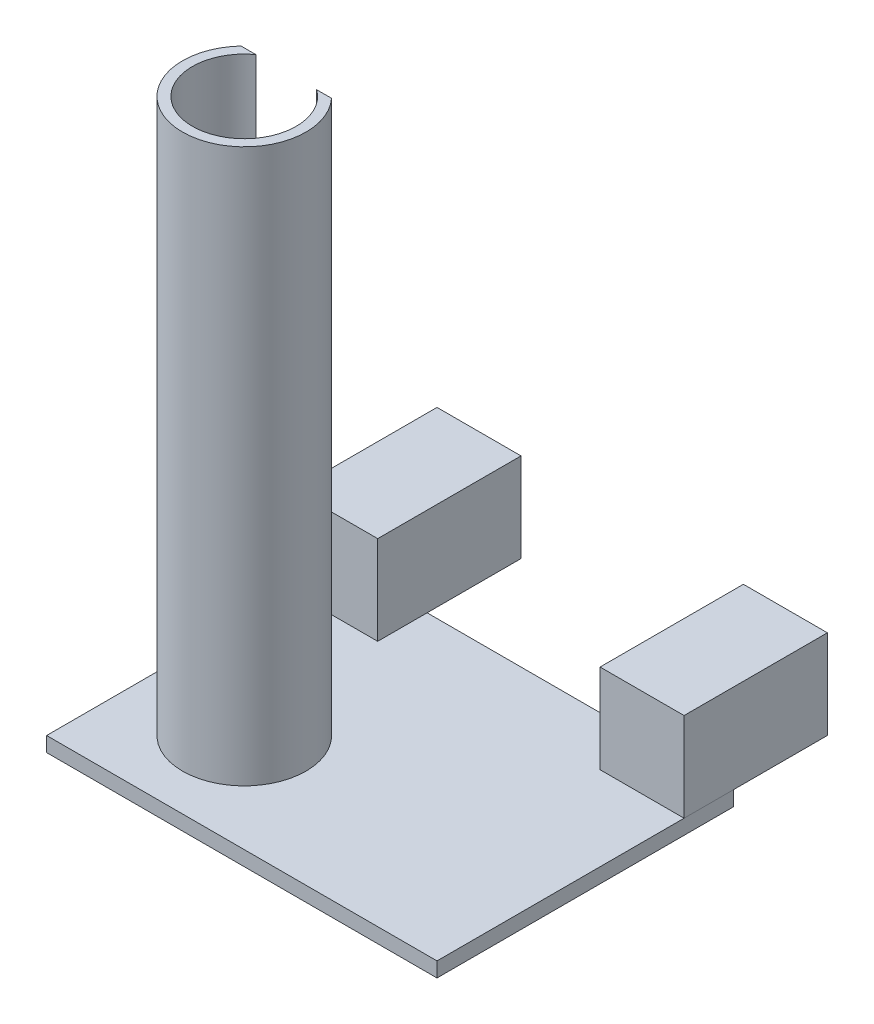
ISO-10303-21;
HEADER;
FILE_DESCRIPTION(('STEP AP214'),'2;1');
FILE_NAME('part.step','',(''),(''),'','','');
FILE_SCHEMA(('AUTOMOTIVE_DESIGN { 1 0 10303 214 1 1 1 1 }'));
ENDSEC;
DATA;
#1=APPLICATION_CONTEXT('core data for automotive mechanical design processes');
#2=APPLICATION_PROTOCOL_DEFINITION('international standard','automotive_design',2000,#1);
#3=PRODUCT_CONTEXT('',#1,'mechanical');
#4=PRODUCT('Part','Part','',(#3));
#5=PRODUCT_RELATED_PRODUCT_CATEGORY('part','',(#4));
#6=PRODUCT_DEFINITION_FORMATION('','',#4);
#7=PRODUCT_DEFINITION_CONTEXT('part definition',#1,'design');
#8=PRODUCT_DEFINITION('design','',#6,#7);
#9=PRODUCT_DEFINITION_SHAPE('','',#8);
#10=(LENGTH_UNIT() NAMED_UNIT(*) SI_UNIT(.MILLI.,.METRE.));
#11=(NAMED_UNIT(*) PLANE_ANGLE_UNIT() SI_UNIT($,.RADIAN.));
#12=(NAMED_UNIT(*) SI_UNIT($,.STERADIAN.) SOLID_ANGLE_UNIT());
#13=UNCERTAINTY_MEASURE_WITH_UNIT(LENGTH_MEASURE(1.E-05),#10,'distance_accuracy_value','');
#14=(GEOMETRIC_REPRESENTATION_CONTEXT(3) GLOBAL_UNCERTAINTY_ASSIGNED_CONTEXT((#13)) GLOBAL_UNIT_ASSIGNED_CONTEXT((#10,
#11,#12)) REPRESENTATION_CONTEXT('',''));
#15=CARTESIAN_POINT('',(0.,0.,0.));
#16=DIRECTION('',(0.,0.,1.));
#17=DIRECTION('',(1.,0.,0.));
#18=AXIS2_PLACEMENT_3D('',#15,#16,#17);
#19=CARTESIAN_POINT('',(39.5,21.,-20.));
#20=DIRECTION('',(-1.,0.,0.));
#21=DIRECTION('',(0.,0.,-1.));
#22=AXIS2_PLACEMENT_3D('',#19,#20,#21);
#23=PLANE('',#22);
#24=DIRECTION('',(0.,0.,1.));
#25=VECTOR('',#24,1.);
#26=CARTESIAN_POINT('',(39.5,3.,-20.));
#27=LINE('',#26,#25);
#28=CARTESIAN_POINT('',(39.5,3.,-49.));
#29=VERTEX_POINT('',#28);
#30=CARTESIAN_POINT('',(39.5,3.,-20.));
#31=VERTEX_POINT('',#30);
#32=EDGE_CURVE('E162',#29,#31,#27,.T.);
#33=ORIENTED_EDGE('',*,*,#32,.F.);
#34=DIRECTION('',(0.,-1.,0.));
#35=VECTOR('',#34,1.);
#36=CARTESIAN_POINT('',(39.5,21.,-49.));
#37=LINE('',#36,#35);
#38=CARTESIAN_POINT('',(39.5,21.,-49.));
#39=VERTEX_POINT('',#38);
#40=EDGE_CURVE('E174',#39,#29,#37,.T.);
#41=ORIENTED_EDGE('',*,*,#40,.F.);
#42=DIRECTION('',(0.,0.,1.));
#43=VECTOR('',#42,1.);
#44=CARTESIAN_POINT('',(39.5,21.,-20.));
#45=LINE('',#44,#43);
#46=CARTESIAN_POINT('',(39.5,21.,-20.));
#47=VERTEX_POINT('',#46);
#48=EDGE_CURVE('E166',#39,#47,#45,.T.);
#49=ORIENTED_EDGE('',*,*,#48,.T.);
#50=DIRECTION('',(0.,-1.,0.));
#51=VECTOR('',#50,1.);
#52=CARTESIAN_POINT('',(39.5,21.,-20.));
#53=LINE('',#52,#51);
#54=EDGE_CURVE('E12',#47,#31,#53,.T.);
#55=ORIENTED_EDGE('',*,*,#54,.T.);
#56=EDGE_LOOP('',(#33,#41,#49,#55));
#57=FACE_BOUND('',#56,.T.);
#58=ADVANCED_FACE('F55',(#57),#23,.F.);
#59=CARTESIAN_POINT('',(39.5,21.,-20.));
#60=DIRECTION('',(0.,0.,-1.));
#61=DIRECTION('',(1.,0.,0.));
#62=AXIS2_PLACEMENT_3D('',#59,#60,#61);
#63=PLANE('',#62);
#64=DIRECTION('',(-1.,0.,0.));
#65=VECTOR('',#64,1.);
#66=CARTESIAN_POINT('',(39.5,3.,-20.));
#67=LINE('',#66,#65);
#68=CARTESIAN_POINT('',(22.5,3.,-20.));
#69=VERTEX_POINT('',#68);
#70=EDGE_CURVE('E176',#31,#69,#67,.T.);
#71=ORIENTED_EDGE('',*,*,#70,.F.);
#72=ORIENTED_EDGE('',*,*,#54,.F.);
#73=DIRECTION('',(-1.,0.,0.));
#74=VECTOR('',#73,1.);
#75=CARTESIAN_POINT('',(39.5,21.,-20.));
#76=LINE('',#75,#74);
#77=CARTESIAN_POINT('',(22.5,21.,-20.));
#78=VERTEX_POINT('',#77);
#79=EDGE_CURVE('E105',#47,#78,#76,.T.);
#80=ORIENTED_EDGE('',*,*,#79,.T.);
#81=DIRECTION('',(0.,-1.,0.));
#82=VECTOR('',#81,1.);
#83=CARTESIAN_POINT('',(22.5,21.,-20.));
#84=LINE('',#83,#82);
#85=EDGE_CURVE('E62',#78,#69,#84,.T.);
#86=ORIENTED_EDGE('',*,*,#85,.T.);
#87=EDGE_LOOP('',(#71,#72,#80,#86));
#88=FACE_BOUND('',#87,.T.);
#89=ADVANCED_FACE('F188',(#88),#63,.F.);
#90=CARTESIAN_POINT('',(22.5,21.,-20.));
#91=DIRECTION('',(1.,0.,0.));
#92=DIRECTION('',(0.,0.,1.));
#93=AXIS2_PLACEMENT_3D('',#90,#91,#92);
#94=PLANE('',#93);
#95=DIRECTION('',(0.,0.,-1.));
#96=VECTOR('',#95,1.);
#97=CARTESIAN_POINT('',(22.5,3.,-20.));
#98=LINE('',#97,#96);
#99=CARTESIAN_POINT('',(22.5,3.,-49.));
#100=VERTEX_POINT('',#99);
#101=EDGE_CURVE('E179',#69,#100,#98,.T.);
#102=ORIENTED_EDGE('',*,*,#101,.F.);
#103=ORIENTED_EDGE('',*,*,#85,.F.);
#104=DIRECTION('',(0.,0.,-1.));
#105=VECTOR('',#104,1.);
#106=CARTESIAN_POINT('',(22.5,21.,-20.));
#107=LINE('',#106,#105);
#108=CARTESIAN_POINT('',(22.5,21.,-49.));
#109=VERTEX_POINT('',#108);
#110=EDGE_CURVE('E170',#78,#109,#107,.T.);
#111=ORIENTED_EDGE('',*,*,#110,.T.);
#112=DIRECTION('',(0.,-1.,0.));
#113=VECTOR('',#112,1.);
#114=CARTESIAN_POINT('',(22.5,21.,-49.));
#115=LINE('',#114,#113);
#116=EDGE_CURVE('E183',#109,#100,#115,.T.);
#117=ORIENTED_EDGE('',*,*,#116,.T.);
#118=EDGE_LOOP('',(#102,#103,#111,#117));
#119=FACE_BOUND('',#118,.T.);
#120=ADVANCED_FACE('F196',(#119),#94,.F.);
#121=CARTESIAN_POINT('',(39.5,21.,-49.));
#122=DIRECTION('',(0.,0.,1.));
#123=DIRECTION('',(-1.,0.,0.));
#124=AXIS2_PLACEMENT_3D('',#121,#122,#123);
#125=PLANE('',#124);
#126=DIRECTION('',(1.,0.,0.));
#127=VECTOR('',#126,1.);
#128=CARTESIAN_POINT('',(39.5,3.,-49.));
#129=LINE('',#128,#127);
#130=EDGE_CURVE('E99',#100,#29,#129,.T.);
#131=ORIENTED_EDGE('',*,*,#130,.F.);
#132=ORIENTED_EDGE('',*,*,#116,.F.);
#133=DIRECTION('',(1.,0.,0.));
#134=VECTOR('',#133,1.);
#135=CARTESIAN_POINT('',(39.5,21.,-49.));
#136=LINE('',#135,#134);
#137=EDGE_CURVE('E78',#109,#39,#136,.T.);
#138=ORIENTED_EDGE('',*,*,#137,.T.);
#139=ORIENTED_EDGE('',*,*,#40,.T.);
#140=EDGE_LOOP('',(#131,#132,#138,#139));
#141=FACE_BOUND('',#140,.T.);
#142=ADVANCED_FACE('F195',(#141),#125,.F.);
#143=CARTESIAN_POINT('',(0.,21.,0.));
#144=DIRECTION('',(0.,-1.,0.));
#145=DIRECTION('',(0.,0.,-1.));
#146=AXIS2_PLACEMENT_3D('',#143,#144,#145);
#147=PLANE('',#146);
#148=ORIENTED_EDGE('',*,*,#48,.F.);
#149=ORIENTED_EDGE('',*,*,#137,.F.);
#150=ORIENTED_EDGE('',*,*,#110,.F.);
#151=ORIENTED_EDGE('',*,*,#79,.F.);
#152=EDGE_LOOP('',(#148,#149,#150,#151));
#153=FACE_BOUND('',#152,.T.);
#154=ADVANCED_FACE('F194',(#153),#147,.F.);
#155=CARTESIAN_POINT('',(0.,3.,0.));
#156=DIRECTION('',(0.,-1.,0.));
#157=DIRECTION('',(0.,0.,-1.));
#158=AXIS2_PLACEMENT_3D('',#155,#156,#157);
#159=PLANE('',#158);
#160=DIRECTION('',(0.,0.,-1.));
#161=VECTOR('',#160,1.);
#162=CARTESIAN_POINT('',(38.,3.,-32.5));
#163=LINE('',#162,#161);
#164=CARTESIAN_POINT('',(38.,3.,-32.5));
#165=VERTEX_POINT('',#164);
#166=CARTESIAN_POINT('',(38.,3.,-46.5));
#167=VERTEX_POINT('',#166);
#168=EDGE_CURVE('E156',#165,#167,#163,.T.);
#169=ORIENTED_EDGE('',*,*,#168,.T.);
#170=DIRECTION('',(-1.,0.,0.));
#171=VECTOR('',#170,1.);
#172=CARTESIAN_POINT('',(38.,3.,-46.5));
#173=LINE('',#172,#171);
#174=CARTESIAN_POINT('',(24.,3.,-46.5));
#175=VERTEX_POINT('',#174);
#176=EDGE_CURVE('E141',#167,#175,#173,.T.);
#177=ORIENTED_EDGE('',*,*,#176,.T.);
#178=DIRECTION('',(0.,0.,1.));
#179=VECTOR('',#178,1.);
#180=CARTESIAN_POINT('',(24.,3.,-32.5));
#181=LINE('',#180,#179);
#182=CARTESIAN_POINT('',(24.,3.,-32.5));
#183=VERTEX_POINT('',#182);
#184=EDGE_CURVE('E151',#175,#183,#181,.T.);
#185=ORIENTED_EDGE('',*,*,#184,.T.);
#186=DIRECTION('',(1.,0.,0.));
#187=VECTOR('',#186,1.);
#188=CARTESIAN_POINT('',(38.,3.,-32.5));
#189=LINE('',#188,#187);
#190=EDGE_CURVE('E148',#183,#165,#189,.T.);
#191=ORIENTED_EDGE('',*,*,#190,.T.);
#192=EDGE_LOOP('',(#169,#177,#185,#191));
#193=FACE_BOUND('',#192,.T.);
#194=ORIENTED_EDGE('',*,*,#32,.T.);
#195=ORIENTED_EDGE('',*,*,#70,.T.);
#196=ORIENTED_EDGE('',*,*,#101,.T.);
#197=ORIENTED_EDGE('',*,*,#130,.T.);
#198=EDGE_LOOP('',(#194,#195,#196,#197));
#199=FACE_BOUND('',#198,.T.);
#200=ADVANCED_FACE('F190',(#193,#199),#159,.T.);
#201=CARTESIAN_POINT('',(38.,19.,-32.5));
#202=DIRECTION('',(1.,0.,0.));
#203=DIRECTION('',(0.,0.,1.));
#204=AXIS2_PLACEMENT_3D('',#201,#202,#203);
#205=PLANE('',#204);
#206=ORIENTED_EDGE('',*,*,#168,.F.);
#207=DIRECTION('',(0.,-1.,0.));
#208=VECTOR('',#207,1.);
#209=CARTESIAN_POINT('',(38.,19.,-32.5));
#210=LINE('',#209,#208);
#211=CARTESIAN_POINT('',(38.,19.,-32.5));
#212=VERTEX_POINT('',#211);
#213=EDGE_CURVE('E147',#212,#165,#210,.T.);
#214=ORIENTED_EDGE('',*,*,#213,.F.);
#215=DIRECTION('',(0.,0.,-1.));
#216=VECTOR('',#215,1.);
#217=CARTESIAN_POINT('',(38.,19.,-32.5));
#218=LINE('',#217,#216);
#219=CARTESIAN_POINT('',(38.,19.,-46.5));
#220=VERTEX_POINT('',#219);
#221=EDGE_CURVE('E133',#212,#220,#218,.T.);
#222=ORIENTED_EDGE('',*,*,#221,.T.);
#223=DIRECTION('',(0.,-1.,0.));
#224=VECTOR('',#223,1.);
#225=CARTESIAN_POINT('',(38.,19.,-46.5));
#226=LINE('',#225,#224);
#227=EDGE_CURVE('E69',#220,#167,#226,.T.);
#228=ORIENTED_EDGE('',*,*,#227,.T.);
#229=EDGE_LOOP('',(#206,#214,#222,#228));
#230=FACE_BOUND('',#229,.T.);
#231=ADVANCED_FACE('F146',(#230),#205,.F.);
#232=CARTESIAN_POINT('',(38.,19.,-32.5));
#233=DIRECTION('',(0.,0.,1.));
#234=DIRECTION('',(-1.,0.,0.));
#235=AXIS2_PLACEMENT_3D('',#232,#233,#234);
#236=PLANE('',#235);
#237=ORIENTED_EDGE('',*,*,#190,.F.);
#238=DIRECTION('',(0.,-1.,0.));
#239=VECTOR('',#238,1.);
#240=CARTESIAN_POINT('',(24.,19.,-32.5));
#241=LINE('',#240,#239);
#242=CARTESIAN_POINT('',(24.,19.,-32.5));
#243=VERTEX_POINT('',#242);
#244=EDGE_CURVE('E163',#243,#183,#241,.T.);
#245=ORIENTED_EDGE('',*,*,#244,.F.);
#246=DIRECTION('',(1.,0.,0.));
#247=VECTOR('',#246,1.);
#248=CARTESIAN_POINT('',(38.,19.,-32.5));
#249=LINE('',#248,#247);
#250=EDGE_CURVE('E144',#243,#212,#249,.T.);
#251=ORIENTED_EDGE('',*,*,#250,.T.);
#252=ORIENTED_EDGE('',*,*,#213,.T.);
#253=EDGE_LOOP('',(#237,#245,#251,#252));
#254=FACE_BOUND('',#253,.T.);
#255=ADVANCED_FACE('F247',(#254),#236,.F.);
#256=CARTESIAN_POINT('',(24.,19.,-32.5));
#257=DIRECTION('',(-1.,0.,0.));
#258=DIRECTION('',(0.,0.,-1.));
#259=AXIS2_PLACEMENT_3D('',#256,#257,#258);
#260=PLANE('',#259);
#261=ORIENTED_EDGE('',*,*,#184,.F.);
#262=DIRECTION('',(0.,-1.,0.));
#263=VECTOR('',#262,1.);
#264=CARTESIAN_POINT('',(24.,19.,-46.5));
#265=LINE('',#264,#263);
#266=CARTESIAN_POINT('',(24.,19.,-46.5));
#267=VERTEX_POINT('',#266);
#268=EDGE_CURVE('E143',#267,#175,#265,.T.);
#269=ORIENTED_EDGE('',*,*,#268,.F.);
#270=DIRECTION('',(0.,0.,1.));
#271=VECTOR('',#270,1.);
#272=CARTESIAN_POINT('',(24.,19.,-32.5));
#273=LINE('',#272,#271);
#274=EDGE_CURVE('E135',#267,#243,#273,.T.);
#275=ORIENTED_EDGE('',*,*,#274,.T.);
#276=ORIENTED_EDGE('',*,*,#244,.T.);
#277=EDGE_LOOP('',(#261,#269,#275,#276));
#278=FACE_BOUND('',#277,.T.);
#279=ADVANCED_FACE('F256',(#278),#260,.F.);
#280=CARTESIAN_POINT('',(38.,19.,-46.5));
#281=DIRECTION('',(0.,0.,-1.));
#282=DIRECTION('',(1.,0.,0.));
#283=AXIS2_PLACEMENT_3D('',#280,#281,#282);
#284=PLANE('',#283);
#285=ORIENTED_EDGE('',*,*,#176,.F.);
#286=ORIENTED_EDGE('',*,*,#227,.F.);
#287=DIRECTION('',(-1.,0.,0.));
#288=VECTOR('',#287,1.);
#289=CARTESIAN_POINT('',(38.,19.,-46.5));
#290=LINE('',#289,#288);
#291=EDGE_CURVE('E130',#220,#267,#290,.T.);
#292=ORIENTED_EDGE('',*,*,#291,.T.);
#293=ORIENTED_EDGE('',*,*,#268,.T.);
#294=EDGE_LOOP('',(#285,#286,#292,#293));
#295=FACE_BOUND('',#294,.T.);
#296=ADVANCED_FACE('F139',(#295),#284,.F.);
#297=CARTESIAN_POINT('',(0.,19.,0.));
#298=DIRECTION('',(0.,-1.,0.));
#299=DIRECTION('',(0.,0.,-1.));
#300=AXIS2_PLACEMENT_3D('',#297,#298,#299);
#301=PLANE('',#300);
#302=ORIENTED_EDGE('',*,*,#221,.F.);
#303=ORIENTED_EDGE('',*,*,#250,.F.);
#304=ORIENTED_EDGE('',*,*,#274,.F.);
#305=ORIENTED_EDGE('',*,*,#291,.F.);
#306=EDGE_LOOP('',(#302,#303,#304,#305));
#307=FACE_BOUND('',#306,.T.);
#308=ADVANCED_FACE('F131',(#307),#301,.T.);
#309=CLOSED_SHELL('',(#58,#89,#120,#142,#154,#200,#231,#255,#279,#296,#308));
#310=MANIFOLD_SOLID_BREP('B2',#309);
#311=CARTESIAN_POINT('',(-39.5,21.,-20.));
#312=DIRECTION('',(1.,0.,0.));
#313=DIRECTION('',(0.,0.,-1.));
#314=AXIS2_PLACEMENT_3D('',#311,#312,#313);
#315=PLANE('',#314);
#316=DIRECTION('',(0.,0.,1.));
#317=VECTOR('',#316,1.);
#318=CARTESIAN_POINT('',(-39.5,3.,-20.));
#319=LINE('',#318,#317);
#320=CARTESIAN_POINT('',(-39.5,3.,-49.));
#321=VERTEX_POINT('',#320);
#322=CARTESIAN_POINT('',(-39.5,3.,-20.));
#323=VERTEX_POINT('',#322);
#324=EDGE_CURVE('E454',#321,#323,#319,.T.);
#325=ORIENTED_EDGE('',*,*,#324,.T.);
#326=DIRECTION('',(0.,-1.,0.));
#327=VECTOR('',#326,1.);
#328=CARTESIAN_POINT('',(-39.5,21.,-20.));
#329=LINE('',#328,#327);
#330=CARTESIAN_POINT('',(-39.5,21.,-20.));
#331=VERTEX_POINT('',#330);
#332=EDGE_CURVE('E53',#331,#323,#329,.T.);
#333=ORIENTED_EDGE('',*,*,#332,.F.);
#334=DIRECTION('',(0.,0.,1.));
#335=VECTOR('',#334,1.);
#336=CARTESIAN_POINT('',(-39.5,21.,-20.));
#337=LINE('',#336,#335);
#338=CARTESIAN_POINT('',(-39.5,21.,-49.));
#339=VERTEX_POINT('',#338);
#340=EDGE_CURVE('E458',#339,#331,#337,.T.);
#341=ORIENTED_EDGE('',*,*,#340,.F.);
#342=DIRECTION('',(0.,-1.,0.));
#343=VECTOR('',#342,1.);
#344=CARTESIAN_POINT('',(-39.5,21.,-49.));
#345=LINE('',#344,#343);
#346=EDGE_CURVE('E464',#339,#321,#345,.T.);
#347=ORIENTED_EDGE('',*,*,#346,.T.);
#348=EDGE_LOOP('',(#325,#333,#341,#347));
#349=FACE_BOUND('',#348,.T.);
#350=ADVANCED_FACE('F346',(#349),#315,.F.);
#351=CARTESIAN_POINT('',(-39.5,21.,-20.));
#352=DIRECTION('',(0.,0.,-1.));
#353=DIRECTION('',(-1.,0.,0.));
#354=AXIS2_PLACEMENT_3D('',#351,#352,#353);
#355=PLANE('',#354);
#356=DIRECTION('',(1.,0.,0.));
#357=VECTOR('',#356,1.);
#358=CARTESIAN_POINT('',(-39.5,3.,-20.));
#359=LINE('',#358,#357);
#360=CARTESIAN_POINT('',(-22.5,3.,-20.));
#361=VERTEX_POINT('',#360);
#362=EDGE_CURVE('E467',#323,#361,#359,.T.);
#363=ORIENTED_EDGE('',*,*,#362,.T.);
#364=DIRECTION('',(0.,-1.,0.));
#365=VECTOR('',#364,1.);
#366=CARTESIAN_POINT('',(-22.5,21.,-20.));
#367=LINE('',#366,#365);
#368=CARTESIAN_POINT('',(-22.5,21.,-20.));
#369=VERTEX_POINT('',#368);
#370=EDGE_CURVE('E353',#369,#361,#367,.T.);
#371=ORIENTED_EDGE('',*,*,#370,.F.);
#372=DIRECTION('',(1.,0.,0.));
#373=VECTOR('',#372,1.);
#374=CARTESIAN_POINT('',(-39.5,21.,-20.));
#375=LINE('',#374,#373);
#376=EDGE_CURVE('E397',#331,#369,#375,.T.);
#377=ORIENTED_EDGE('',*,*,#376,.F.);
#378=ORIENTED_EDGE('',*,*,#332,.T.);
#379=EDGE_LOOP('',(#363,#371,#377,#378));
#380=FACE_BOUND('',#379,.T.);
#381=ADVANCED_FACE('F495',(#380),#355,.F.);
#382=CARTESIAN_POINT('',(-22.5,21.,-20.));
#383=DIRECTION('',(-1.,0.,0.));
#384=DIRECTION('',(0.,0.,1.));
#385=AXIS2_PLACEMENT_3D('',#382,#383,#384);
#386=PLANE('',#385);
#387=DIRECTION('',(0.,0.,-1.));
#388=VECTOR('',#387,1.);
#389=CARTESIAN_POINT('',(-22.5,3.,-20.));
#390=LINE('',#389,#388);
#391=CARTESIAN_POINT('',(-22.5,3.,-49.));
#392=VERTEX_POINT('',#391);
#393=EDGE_CURVE('E469',#361,#392,#390,.T.);
#394=ORIENTED_EDGE('',*,*,#393,.T.);
#395=DIRECTION('',(0.,-1.,0.));
#396=VECTOR('',#395,1.);
#397=CARTESIAN_POINT('',(-22.5,21.,-49.));
#398=LINE('',#397,#396);
#399=CARTESIAN_POINT('',(-22.5,21.,-49.));
#400=VERTEX_POINT('',#399);
#401=EDGE_CURVE('E473',#400,#392,#398,.T.);
#402=ORIENTED_EDGE('',*,*,#401,.F.);
#403=DIRECTION('',(0.,0.,-1.));
#404=VECTOR('',#403,1.);
#405=CARTESIAN_POINT('',(-22.5,21.,-20.));
#406=LINE('',#405,#404);
#407=EDGE_CURVE('E461',#369,#400,#406,.T.);
#408=ORIENTED_EDGE('',*,*,#407,.F.);
#409=ORIENTED_EDGE('',*,*,#370,.T.);
#410=EDGE_LOOP('',(#394,#402,#408,#409));
#411=FACE_BOUND('',#410,.T.);
#412=ADVANCED_FACE('F478',(#411),#386,.F.);
#413=CARTESIAN_POINT('',(-39.5,21.,-49.));
#414=DIRECTION('',(0.,0.,1.));
#415=DIRECTION('',(1.,0.,0.));
#416=AXIS2_PLACEMENT_3D('',#413,#414,#415);
#417=PLANE('',#416);
#418=DIRECTION('',(-1.,0.,0.));
#419=VECTOR('',#418,1.);
#420=CARTESIAN_POINT('',(-39.5,3.,-49.));
#421=LINE('',#420,#419);
#422=EDGE_CURVE('E390',#392,#321,#421,.T.);
#423=ORIENTED_EDGE('',*,*,#422,.T.);
#424=ORIENTED_EDGE('',*,*,#346,.F.);
#425=DIRECTION('',(-1.,0.,0.));
#426=VECTOR('',#425,1.);
#427=CARTESIAN_POINT('',(-39.5,21.,-49.));
#428=LINE('',#427,#426);
#429=EDGE_CURVE('E369',#400,#339,#428,.T.);
#430=ORIENTED_EDGE('',*,*,#429,.F.);
#431=ORIENTED_EDGE('',*,*,#401,.T.);
#432=EDGE_LOOP('',(#423,#424,#430,#431));
#433=FACE_BOUND('',#432,.T.);
#434=ADVANCED_FACE('F486',(#433),#417,.F.);
#435=CARTESIAN_POINT('',(0.,21.,0.));
#436=DIRECTION('',(0.,-1.,0.));
#437=DIRECTION('',(0.,0.,-1.));
#438=AXIS2_PLACEMENT_3D('',#435,#436,#437);
#439=PLANE('',#438);
#440=ORIENTED_EDGE('',*,*,#340,.T.);
#441=ORIENTED_EDGE('',*,*,#376,.T.);
#442=ORIENTED_EDGE('',*,*,#407,.T.);
#443=ORIENTED_EDGE('',*,*,#429,.T.);
#444=EDGE_LOOP('',(#440,#441,#442,#443));
#445=FACE_BOUND('',#444,.T.);
#446=ADVANCED_FACE('F488',(#445),#439,.F.);
#447=CARTESIAN_POINT('',(0.,3.,0.));
#448=DIRECTION('',(0.,-1.,0.));
#449=DIRECTION('',(0.,0.,-1.));
#450=AXIS2_PLACEMENT_3D('',#447,#448,#449);
#451=PLANE('',#450);
#452=DIRECTION('',(0.,0.,-1.));
#453=VECTOR('',#452,1.);
#454=CARTESIAN_POINT('',(-38.,3.,-32.5));
#455=LINE('',#454,#453);
#456=CARTESIAN_POINT('',(-38.,3.,-32.5));
#457=VERTEX_POINT('',#456);
#458=CARTESIAN_POINT('',(-38.,3.,-46.5));
#459=VERTEX_POINT('',#458);
#460=EDGE_CURVE('E360',#457,#459,#455,.T.);
#461=ORIENTED_EDGE('',*,*,#460,.F.);
#462=DIRECTION('',(-1.,0.,0.));
#463=VECTOR('',#462,1.);
#464=CARTESIAN_POINT('',(-38.,3.,-32.5));
#465=LINE('',#464,#463);
#466=CARTESIAN_POINT('',(-24.,3.,-32.5));
#467=VERTEX_POINT('',#466);
#468=EDGE_CURVE('E439',#467,#457,#465,.T.);
#469=ORIENTED_EDGE('',*,*,#468,.F.);
#470=DIRECTION('',(0.,0.,1.));
#471=VECTOR('',#470,1.);
#472=CARTESIAN_POINT('',(-24.,3.,-32.5));
#473=LINE('',#472,#471);
#474=CARTESIAN_POINT('',(-24.,3.,-46.5));
#475=VERTEX_POINT('',#474);
#476=EDGE_CURVE('E442',#475,#467,#473,.T.);
#477=ORIENTED_EDGE('',*,*,#476,.F.);
#478=DIRECTION('',(1.,0.,0.));
#479=VECTOR('',#478,1.);
#480=CARTESIAN_POINT('',(-38.,3.,-46.5));
#481=LINE('',#480,#479);
#482=EDGE_CURVE('E448',#459,#475,#481,.T.);
#483=ORIENTED_EDGE('',*,*,#482,.F.);
#484=EDGE_LOOP('',(#461,#469,#477,#483));
#485=FACE_BOUND('',#484,.T.);
#486=ORIENTED_EDGE('',*,*,#324,.F.);
#487=ORIENTED_EDGE('',*,*,#422,.F.);
#488=ORIENTED_EDGE('',*,*,#393,.F.);
#489=ORIENTED_EDGE('',*,*,#362,.F.);
#490=EDGE_LOOP('',(#486,#487,#488,#489));
#491=FACE_BOUND('',#490,.T.);
#492=ADVANCED_FACE('F482',(#485,#491),#451,.T.);
#493=CARTESIAN_POINT('',(-38.,19.,-32.5));
#494=DIRECTION('',(-1.,0.,0.));
#495=DIRECTION('',(0.,0.,1.));
#496=AXIS2_PLACEMENT_3D('',#493,#494,#495);
#497=PLANE('',#496);
#498=ORIENTED_EDGE('',*,*,#460,.T.);
#499=DIRECTION('',(0.,-1.,0.));
#500=VECTOR('',#499,1.);
#501=CARTESIAN_POINT('',(-38.,19.,-46.5));
#502=LINE('',#501,#500);
#503=CARTESIAN_POINT('',(-38.,19.,-46.5));
#504=VERTEX_POINT('',#503);
#505=EDGE_CURVE('E417',#504,#459,#502,.T.);
#506=ORIENTED_EDGE('',*,*,#505,.F.);
#507=DIRECTION('',(0.,0.,-1.));
#508=VECTOR('',#507,1.);
#509=CARTESIAN_POINT('',(-38.,19.,-32.5));
#510=LINE('',#509,#508);
#511=CARTESIAN_POINT('',(-38.,19.,-32.5));
#512=VERTEX_POINT('',#511);
#513=EDGE_CURVE('E421',#512,#504,#510,.T.);
#514=ORIENTED_EDGE('',*,*,#513,.F.);
#515=DIRECTION('',(0.,-1.,0.));
#516=VECTOR('',#515,1.);
#517=CARTESIAN_POINT('',(-38.,19.,-32.5));
#518=LINE('',#517,#516);
#519=EDGE_CURVE('E452',#512,#457,#518,.T.);
#520=ORIENTED_EDGE('',*,*,#519,.T.);
#521=EDGE_LOOP('',(#498,#506,#514,#520));
#522=FACE_BOUND('',#521,.T.);
#523=ADVANCED_FACE('F419',(#522),#497,.F.);
#524=CARTESIAN_POINT('',(-38.,19.,-32.5));
#525=DIRECTION('',(0.,0.,1.));
#526=DIRECTION('',(1.,0.,0.));
#527=AXIS2_PLACEMENT_3D('',#524,#525,#526);
#528=PLANE('',#527);
#529=ORIENTED_EDGE('',*,*,#468,.T.);
#530=ORIENTED_EDGE('',*,*,#519,.F.);
#531=DIRECTION('',(-1.,0.,0.));
#532=VECTOR('',#531,1.);
#533=CARTESIAN_POINT('',(-38.,19.,-32.5));
#534=LINE('',#533,#532);
#535=CARTESIAN_POINT('',(-24.,19.,-32.5));
#536=VERTEX_POINT('',#535);
#537=EDGE_CURVE('E427',#536,#512,#534,.T.);
#538=ORIENTED_EDGE('',*,*,#537,.F.);
#539=DIRECTION('',(0.,-1.,0.));
#540=VECTOR('',#539,1.);
#541=CARTESIAN_POINT('',(-24.,19.,-32.5));
#542=LINE('',#541,#540);
#543=EDGE_CURVE('E455',#536,#467,#542,.T.);
#544=ORIENTED_EDGE('',*,*,#543,.T.);
#545=EDGE_LOOP('',(#529,#530,#538,#544));
#546=FACE_BOUND('',#545,.T.);
#547=ADVANCED_FACE('F535',(#546),#528,.F.);
#548=CARTESIAN_POINT('',(-24.,19.,-32.5));
#549=DIRECTION('',(1.,0.,0.));
#550=DIRECTION('',(0.,0.,-1.));
#551=AXIS2_PLACEMENT_3D('',#548,#549,#550);
#552=PLANE('',#551);
#553=ORIENTED_EDGE('',*,*,#476,.T.);
#554=ORIENTED_EDGE('',*,*,#543,.F.);
#555=DIRECTION('',(0.,0.,1.));
#556=VECTOR('',#555,1.);
#557=CARTESIAN_POINT('',(-24.,19.,-32.5));
#558=LINE('',#557,#556);
#559=CARTESIAN_POINT('',(-24.,19.,-46.5));
#560=VERTEX_POINT('',#559);
#561=EDGE_CURVE('E435',#560,#536,#558,.T.);
#562=ORIENTED_EDGE('',*,*,#561,.F.);
#563=DIRECTION('',(0.,-1.,0.));
#564=VECTOR('',#563,1.);
#565=CARTESIAN_POINT('',(-24.,19.,-46.5));
#566=LINE('',#565,#564);
#567=EDGE_CURVE('E426',#560,#475,#566,.T.);
#568=ORIENTED_EDGE('',*,*,#567,.T.);
#569=EDGE_LOOP('',(#553,#554,#562,#568));
#570=FACE_BOUND('',#569,.T.);
#571=ADVANCED_FACE('F544',(#570),#552,.F.);
#572=CARTESIAN_POINT('',(-38.,19.,-46.5));
#573=DIRECTION('',(0.,0.,-1.));
#574=DIRECTION('',(-1.,0.,0.));
#575=AXIS2_PLACEMENT_3D('',#572,#573,#574);
#576=PLANE('',#575);
#577=ORIENTED_EDGE('',*,*,#482,.T.);
#578=ORIENTED_EDGE('',*,*,#567,.F.);
#579=DIRECTION('',(1.,0.,0.));
#580=VECTOR('',#579,1.);
#581=CARTESIAN_POINT('',(-38.,19.,-46.5));
#582=LINE('',#581,#580);
#583=EDGE_CURVE('E430',#504,#560,#582,.T.);
#584=ORIENTED_EDGE('',*,*,#583,.F.);
#585=ORIENTED_EDGE('',*,*,#505,.T.);
#586=EDGE_LOOP('',(#577,#578,#584,#585));
#587=FACE_BOUND('',#586,.T.);
#588=ADVANCED_FACE('F431',(#587),#576,.F.);
#589=CARTESIAN_POINT('',(0.,19.,0.));
#590=DIRECTION('',(0.,-1.,0.));
#591=DIRECTION('',(0.,0.,-1.));
#592=AXIS2_PLACEMENT_3D('',#589,#590,#591);
#593=PLANE('',#592);
#594=ORIENTED_EDGE('',*,*,#513,.T.);
#595=ORIENTED_EDGE('',*,*,#583,.T.);
#596=ORIENTED_EDGE('',*,*,#561,.T.);
#597=ORIENTED_EDGE('',*,*,#537,.T.);
#598=EDGE_LOOP('',(#594,#595,#596,#597));
#599=FACE_BOUND('',#598,.T.);
#600=ADVANCED_FACE('F437',(#599),#593,.T.);
#601=CLOSED_SHELL('',(#350,#381,#412,#434,#446,#492,#523,#547,#571,#588,#600));
#602=MANIFOLD_SOLID_BREP('B6',#601);
#603=CARTESIAN_POINT('',(-39.5,115.,1.5));
#604=DIRECTION('',(0.,0.,-1.));
#605=DIRECTION('',(-1.,0.,0.));
#606=AXIS2_PLACEMENT_3D('',#603,#604,#605);
#607=PLANE('',#606);
#608=DIRECTION('',(1.,0.,0.));
#609=VECTOR('',#608,1.);
#610=CARTESIAN_POINT('',(-39.5,3.,1.5));
#611=LINE('',#610,#609);
#612=CARTESIAN_POINT('',(-13.335585997031,3.,1.5));
#613=VERTEX_POINT('',#612);
#614=CARTESIAN_POINT('',(-10.3348486100883,3.,1.5));
#615=VERTEX_POINT('',#614);
#616=EDGE_CURVE('E714',#613,#615,#611,.T.);
#617=ORIENTED_EDGE('',*,*,#616,.F.);
#618=DIRECTION('',(0.,-1.,0.));
#619=VECTOR('',#618,1.);
#620=CARTESIAN_POINT('',(-13.335585997031,115.,1.5));
#621=LINE('',#620,#619);
#622=CARTESIAN_POINT('',(-13.335585997031,115.,1.5));
#623=VERTEX_POINT('',#622);
#624=EDGE_CURVE('E344',#613,#623,#621,.F.);
#625=ORIENTED_EDGE('',*,*,#624,.T.);
#626=DIRECTION('',(-1.,0.,0.));
#627=VECTOR('',#626,1.);
#628=CARTESIAN_POINT('',(-19.5,115.,1.5));
#629=LINE('',#628,#627);
#630=CARTESIAN_POINT('',(-10.3348486100883,115.,1.5));
#631=VERTEX_POINT('',#630);
#632=EDGE_CURVE('E706',#631,#623,#629,.T.);
#633=ORIENTED_EDGE('',*,*,#632,.F.);
#634=DIRECTION('',(0.,-1.,0.));
#635=VECTOR('',#634,1.);
#636=CARTESIAN_POINT('',(-10.3348486100883,115.,1.5));
#637=LINE('',#636,#635);
#638=EDGE_CURVE('E718',#631,#615,#637,.T.);
#639=ORIENTED_EDGE('',*,*,#638,.T.);
#640=EDGE_LOOP('',(#617,#625,#633,#639));
#641=FACE_BOUND('',#640,.T.);
#642=ADVANCED_FACE('F629',(#641),#607,.T.);
#643=CARTESIAN_POINT('',(-25.664414002969,115.,1.5));
#644=VERTEX_POINT('',#643);
#645=CARTESIAN_POINT('',(-28.6651513899117,115.,1.5));
#646=VERTEX_POINT('',#645);
#647=EDGE_CURVE('E653',#644,#646,#629,.T.);
#648=ORIENTED_EDGE('',*,*,#647,.F.);
#649=DIRECTION('',(0.,-1.,0.));
#650=VECTOR('',#649,1.);
#651=CARTESIAN_POINT('',(-25.664414002969,115.,1.5));
#652=LINE('',#651,#650);
#653=CARTESIAN_POINT('',(-25.664414002969,3.,1.5));
#654=VERTEX_POINT('',#653);
#655=EDGE_CURVE('E638',#644,#654,#652,.T.);
#656=ORIENTED_EDGE('',*,*,#655,.T.);
#657=CARTESIAN_POINT('',(-28.6651513899117,3.,1.5));
#658=VERTEX_POINT('',#657);
#659=EDGE_CURVE('E703',#658,#654,#611,.T.);
#660=ORIENTED_EDGE('',*,*,#659,.F.);
#661=DIRECTION('',(0.,-1.,0.));
#662=VECTOR('',#661,1.);
#663=CARTESIAN_POINT('',(-28.6651513899117,115.,1.5));
#664=LINE('',#663,#662);
#665=EDGE_CURVE('E713',#658,#646,#664,.F.);
#666=ORIENTED_EDGE('',*,*,#665,.T.);
#667=EDGE_LOOP('',(#648,#656,#660,#666));
#668=FACE_BOUND('',#667,.T.);
#669=ADVANCED_FACE('F702',(#668),#607,.T.);
#670=CARTESIAN_POINT('',(-19.5,115.,10.));
#671=DIRECTION('',(0.,-1.,0.));
#672=DIRECTION('',(0.,0.,-1.));
#673=AXIS2_PLACEMENT_3D('',#670,#671,#672);
#674=CYLINDRICAL_SURFACE('',#673,12.5);
#675=ORIENTED_EDGE('',*,*,#638,.F.);
#676=CARTESIAN_POINT('',(-19.5,115.,10.));
#677=DIRECTION('',(0.,1.,0.));
#678=DIRECTION('',(0.,0.,1.));
#679=AXIS2_PLACEMENT_3D('',#676,#677,#678);
#680=CIRCLE('',#679,12.5);
#681=EDGE_CURVE('E725',#646,#631,#680,.T.);
#682=ORIENTED_EDGE('',*,*,#681,.F.);
#683=ORIENTED_EDGE('',*,*,#665,.F.);
#684=CARTESIAN_POINT('',(-19.5,3.,10.));
#685=DIRECTION('',(0.,-1.,0.));
#686=DIRECTION('',(0.,0.,-1.));
#687=AXIS2_PLACEMENT_3D('',#684,#685,#686);
#688=CIRCLE('',#687,12.5);
#689=EDGE_CURVE('E711',#658,#615,#688,.F.);
#690=ORIENTED_EDGE('',*,*,#689,.T.);
#691=EDGE_LOOP('',(#675,#682,#683,#690));
#692=FACE_BOUND('',#691,.T.);
#693=ADVANCED_FACE('F780',(#692),#674,.T.);
#694=CARTESIAN_POINT('',(-19.5,115.,10.));
#695=DIRECTION('',(0.,1.,0.));
#696=DIRECTION('',(0.,0.,1.));
#697=AXIS2_PLACEMENT_3D('',#694,#695,#696);
#698=PLANE('',#697);
#699=ORIENTED_EDGE('',*,*,#632,.T.);
#700=CARTESIAN_POINT('',(-19.5,115.,10.));
#701=DIRECTION('',(0.,1.,0.));
#702=DIRECTION('',(0.,0.,1.));
#703=AXIS2_PLACEMENT_3D('',#700,#701,#702);
#704=CIRCLE('',#703,10.5);
#705=EDGE_CURVE('E699',#644,#623,#704,.T.);
#706=ORIENTED_EDGE('',*,*,#705,.F.);
#707=ORIENTED_EDGE('',*,*,#647,.T.);
#708=ORIENTED_EDGE('',*,*,#681,.T.);
#709=EDGE_LOOP('',(#699,#706,#707,#708));
#710=FACE_BOUND('',#709,.T.);
#711=ADVANCED_FACE('F775',(#710),#698,.T.);
#712=CARTESIAN_POINT('',(39.5,3.,30.));
#713=DIRECTION('',(-1.,0.,0.));
#714=DIRECTION('',(0.,0.,1.));
#715=AXIS2_PLACEMENT_3D('',#712,#713,#714);
#716=PLANE('',#715);
#717=DIRECTION('',(0.,0.,-1.));
#718=VECTOR('',#717,1.);
#719=CARTESIAN_POINT('',(39.5,0.,30.));
#720=LINE('',#719,#718);
#721=CARTESIAN_POINT('',(39.5,0.,30.));
#722=VERTEX_POINT('',#721);
#723=CARTESIAN_POINT('',(39.5,0.,-30.));
#724=VERTEX_POINT('',#723);
#725=EDGE_CURVE('E728',#722,#724,#720,.T.);
#726=ORIENTED_EDGE('',*,*,#725,.T.);
#727=DIRECTION('',(0.,-1.,0.));
#728=VECTOR('',#727,1.);
#729=CARTESIAN_POINT('',(39.5,3.,-30.));
#730=LINE('',#729,#728);
#731=CARTESIAN_POINT('',(39.5,3.,-30.));
#732=VERTEX_POINT('',#731);
#733=EDGE_CURVE('E766',#732,#724,#730,.T.);
#734=ORIENTED_EDGE('',*,*,#733,.F.);
#735=DIRECTION('',(0.,0.,-1.));
#736=VECTOR('',#735,1.);
#737=CARTESIAN_POINT('',(39.5,3.,30.));
#738=LINE('',#737,#736);
#739=CARTESIAN_POINT('',(39.5,3.,30.));
#740=VERTEX_POINT('',#739);
#741=EDGE_CURVE('E729',#740,#732,#738,.T.);
#742=ORIENTED_EDGE('',*,*,#741,.F.);
#743=DIRECTION('',(0.,-1.,0.));
#744=VECTOR('',#743,1.);
#745=CARTESIAN_POINT('',(39.5,3.,30.));
#746=LINE('',#745,#744);
#747=EDGE_CURVE('E743',#740,#722,#746,.T.);
#748=ORIENTED_EDGE('',*,*,#747,.T.);
#749=EDGE_LOOP('',(#726,#734,#742,#748));
#750=FACE_BOUND('',#749,.T.);
#751=ADVANCED_FACE('F631',(#750),#716,.F.);
#752=CARTESIAN_POINT('',(-39.5,3.,-30.));
#753=DIRECTION('',(0.,0.,1.));
#754=DIRECTION('',(1.,0.,0.));
#755=AXIS2_PLACEMENT_3D('',#752,#753,#754);
#756=PLANE('',#755);
#757=DIRECTION('',(-1.,0.,0.));
#758=VECTOR('',#757,1.);
#759=CARTESIAN_POINT('',(-39.5,0.,-30.));
#760=LINE('',#759,#758);
#761=CARTESIAN_POINT('',(-39.5,0.,-30.));
#762=VERTEX_POINT('',#761);
#763=EDGE_CURVE('E747',#724,#762,#760,.T.);
#764=ORIENTED_EDGE('',*,*,#763,.T.);
#765=DIRECTION('',(0.,-1.,0.));
#766=VECTOR('',#765,1.);
#767=CARTESIAN_POINT('',(-39.5,3.,-30.));
#768=LINE('',#767,#766);
#769=CARTESIAN_POINT('',(-39.5,3.,-30.));
#770=VERTEX_POINT('',#769);
#771=EDGE_CURVE('E762',#770,#762,#768,.T.);
#772=ORIENTED_EDGE('',*,*,#771,.F.);
#773=DIRECTION('',(-1.,0.,0.));
#774=VECTOR('',#773,1.);
#775=CARTESIAN_POINT('',(-39.5,3.,-30.));
#776=LINE('',#775,#774);
#777=EDGE_CURVE('E733',#732,#770,#776,.T.);
#778=ORIENTED_EDGE('',*,*,#777,.F.);
#779=ORIENTED_EDGE('',*,*,#733,.T.);
#780=EDGE_LOOP('',(#764,#772,#778,#779));
#781=FACE_BOUND('',#780,.T.);
#782=ADVANCED_FACE('F812',(#781),#756,.F.);
#783=CARTESIAN_POINT('',(-39.5,3.,30.));
#784=DIRECTION('',(1.,0.,0.));
#785=DIRECTION('',(0.,0.,-1.));
#786=AXIS2_PLACEMENT_3D('',#783,#784,#785);
#787=PLANE('',#786);
#788=DIRECTION('',(0.,0.,1.));
#789=VECTOR('',#788,1.);
#790=CARTESIAN_POINT('',(-39.5,0.,30.));
#791=LINE('',#790,#789);
#792=CARTESIAN_POINT('',(-39.5,0.,30.));
#793=VERTEX_POINT('',#792);
#794=EDGE_CURVE('E750',#762,#793,#791,.T.);
#795=ORIENTED_EDGE('',*,*,#794,.T.);
#796=DIRECTION('',(0.,-1.,0.));
#797=VECTOR('',#796,1.);
#798=CARTESIAN_POINT('',(-39.5,3.,30.));
#799=LINE('',#798,#797);
#800=CARTESIAN_POINT('',(-39.5,3.,30.));
#801=VERTEX_POINT('',#800);
#802=EDGE_CURVE('E758',#801,#793,#799,.T.);
#803=ORIENTED_EDGE('',*,*,#802,.F.);
#804=DIRECTION('',(0.,0.,1.));
#805=VECTOR('',#804,1.);
#806=CARTESIAN_POINT('',(-39.5,3.,30.));
#807=LINE('',#806,#805);
#808=EDGE_CURVE('E737',#770,#801,#807,.T.);
#809=ORIENTED_EDGE('',*,*,#808,.F.);
#810=ORIENTED_EDGE('',*,*,#771,.T.);
#811=EDGE_LOOP('',(#795,#803,#809,#810));
#812=FACE_BOUND('',#811,.T.);
#813=ADVANCED_FACE('F809',(#812),#787,.F.);
#814=CARTESIAN_POINT('',(-39.5,3.,30.));
#815=DIRECTION('',(0.,0.,-1.));
#816=DIRECTION('',(-1.,0.,0.));
#817=AXIS2_PLACEMENT_3D('',#814,#815,#816);
#818=PLANE('',#817);
#819=DIRECTION('',(1.,0.,0.));
#820=VECTOR('',#819,1.);
#821=CARTESIAN_POINT('',(-39.5,0.,30.));
#822=LINE('',#821,#820);
#823=EDGE_CURVE('E734',#793,#722,#822,.T.);
#824=ORIENTED_EDGE('',*,*,#823,.T.);
#825=ORIENTED_EDGE('',*,*,#747,.F.);
#826=DIRECTION('',(1.,0.,0.));
#827=VECTOR('',#826,1.);
#828=CARTESIAN_POINT('',(-39.5,3.,30.));
#829=LINE('',#828,#827);
#830=EDGE_CURVE('E740',#801,#740,#829,.T.);
#831=ORIENTED_EDGE('',*,*,#830,.F.);
#832=ORIENTED_EDGE('',*,*,#802,.T.);
#833=EDGE_LOOP('',(#824,#825,#831,#832));
#834=FACE_BOUND('',#833,.T.);
#835=ADVANCED_FACE('F805',(#834),#818,.F.);
#836=CARTESIAN_POINT('',(0.,3.,0.));
#837=DIRECTION('',(0.,-1.,0.));
#838=DIRECTION('',(0.,0.,-1.));
#839=AXIS2_PLACEMENT_3D('',#836,#837,#838);
#840=PLANE('',#839);
#841=ORIENTED_EDGE('',*,*,#659,.T.);
#842=CARTESIAN_POINT('',(-19.5,3.,10.));
#843=DIRECTION('',(0.,1.,0.));
#844=DIRECTION('',(0.,0.,1.));
#845=AXIS2_PLACEMENT_3D('',#842,#843,#844);
#846=CIRCLE('',#845,10.5);
#847=EDGE_CURVE('E645',#654,#613,#846,.T.);
#848=ORIENTED_EDGE('',*,*,#847,.T.);
#849=ORIENTED_EDGE('',*,*,#616,.T.);
#850=ORIENTED_EDGE('',*,*,#689,.F.);
#851=EDGE_LOOP('',(#841,#848,#849,#850));
#852=FACE_BOUND('',#851,.T.);
#853=ORIENTED_EDGE('',*,*,#808,.T.);
#854=ORIENTED_EDGE('',*,*,#830,.T.);
#855=ORIENTED_EDGE('',*,*,#741,.T.);
#856=ORIENTED_EDGE('',*,*,#777,.T.);
#857=EDGE_LOOP('',(#853,#854,#855,#856));
#858=FACE_BOUND('',#857,.T.);
#859=ADVANCED_FACE('F708',(#852,#858),#840,.F.);
#860=CARTESIAN_POINT('',(0.,0.,0.));
#861=DIRECTION('',(0.,-1.,0.));
#862=DIRECTION('',(0.,0.,-1.));
#863=AXIS2_PLACEMENT_3D('',#860,#861,#862);
#864=PLANE('',#863);
#865=ORIENTED_EDGE('',*,*,#725,.F.);
#866=ORIENTED_EDGE('',*,*,#823,.F.);
#867=ORIENTED_EDGE('',*,*,#794,.F.);
#868=ORIENTED_EDGE('',*,*,#763,.F.);
#869=EDGE_LOOP('',(#865,#866,#867,#868));
#870=FACE_BOUND('',#869,.T.);
#871=ADVANCED_FACE('F796',(#870),#864,.T.);
#872=CARTESIAN_POINT('',(-19.5,115.,10.));
#873=DIRECTION('',(0.,-1.,0.));
#874=DIRECTION('',(0.,0.,-1.));
#875=AXIS2_PLACEMENT_3D('',#872,#873,#874);
#876=CYLINDRICAL_SURFACE('',#875,10.5);
#877=ORIENTED_EDGE('',*,*,#847,.F.);
#878=ORIENTED_EDGE('',*,*,#655,.F.);
#879=ORIENTED_EDGE('',*,*,#705,.T.);
#880=ORIENTED_EDGE('',*,*,#624,.F.);
#881=EDGE_LOOP('',(#877,#878,#879,#880));
#882=FACE_BOUND('',#881,.T.);
#883=ADVANCED_FACE('F696',(#882),#876,.F.);
#884=CLOSED_SHELL('',(#642,#669,#693,#711,#751,#782,#813,#835,#859,#871,#883));
#885=MANIFOLD_SOLID_BREP('B47',#884);
#886=ADVANCED_BREP_SHAPE_REPRESENTATION('',(#18,#310,#602,#885),#14);
#887=SHAPE_DEFINITION_REPRESENTATION(#9,#886);
ENDSEC;
END-ISO-10303-21;
